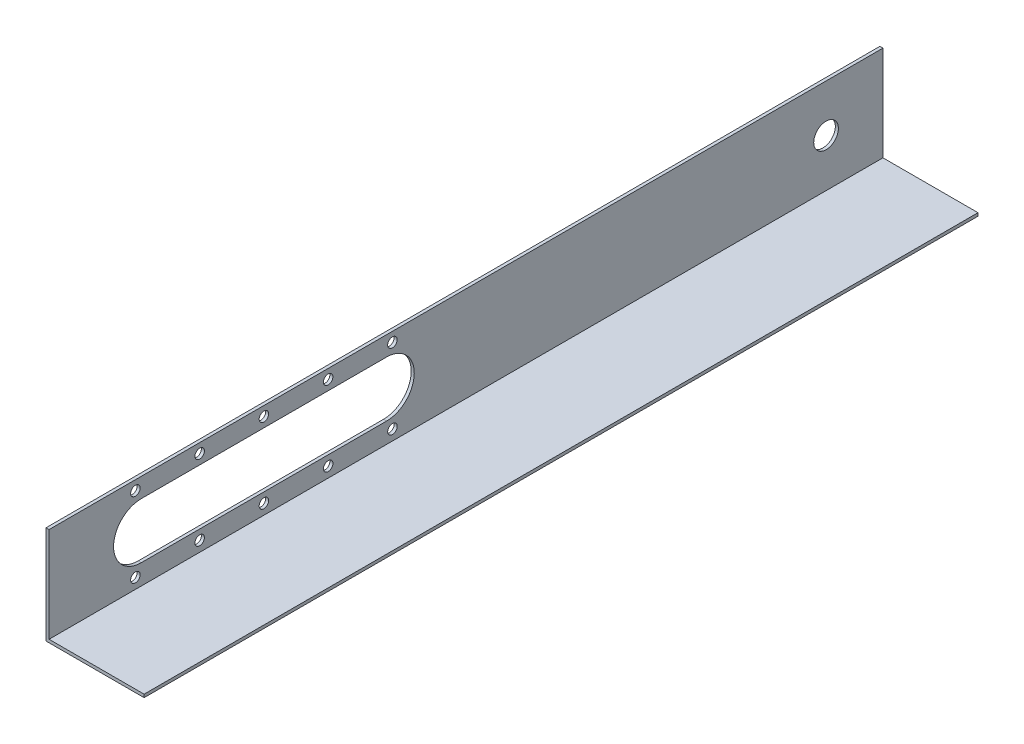
ISO-10303-21;
HEADER;
FILE_DESCRIPTION(('STEP AP214'),'2;1');
FILE_NAME('part.step','',(''),(''),'','','');
FILE_SCHEMA(('AUTOMOTIVE_DESIGN { 1 0 10303 214 1 1 1 1 }'));
ENDSEC;
DATA;
#1=APPLICATION_CONTEXT('core data for automotive mechanical design processes');
#2=APPLICATION_PROTOCOL_DEFINITION('international standard','automotive_design',2000,#1);
#3=PRODUCT_CONTEXT('',#1,'mechanical');
#4=PRODUCT('Part','Part','',(#3));
#5=PRODUCT_RELATED_PRODUCT_CATEGORY('part','',(#4));
#6=PRODUCT_DEFINITION_FORMATION('','',#4);
#7=PRODUCT_DEFINITION_CONTEXT('part definition',#1,'design');
#8=PRODUCT_DEFINITION('design','',#6,#7);
#9=PRODUCT_DEFINITION_SHAPE('','',#8);
#10=(LENGTH_UNIT() NAMED_UNIT(*) SI_UNIT(.MILLI.,.METRE.));
#11=(NAMED_UNIT(*) PLANE_ANGLE_UNIT() SI_UNIT($,.RADIAN.));
#12=(NAMED_UNIT(*) SI_UNIT($,.STERADIAN.) SOLID_ANGLE_UNIT());
#13=UNCERTAINTY_MEASURE_WITH_UNIT(LENGTH_MEASURE(1.E-05),#10,'distance_accuracy_value','');
#14=(GEOMETRIC_REPRESENTATION_CONTEXT(3) GLOBAL_UNCERTAINTY_ASSIGNED_CONTEXT((#13)) GLOBAL_UNIT_ASSIGNED_CONTEXT((#10,
#11,#12)) REPRESENTATION_CONTEXT('',''));
#15=CARTESIAN_POINT('',(0.,0.,0.));
#16=DIRECTION('',(0.,0.,1.));
#17=DIRECTION('',(1.,0.,0.));
#18=AXIS2_PLACEMENT_3D('',#15,#16,#17);
#19=CARTESIAN_POINT('',(0.,0.,431.8));
#20=DIRECTION('',(-1.,0.,0.));
#21=DIRECTION('',(0.,-1.,0.));
#22=AXIS2_PLACEMENT_3D('',#19,#20,#21);
#23=PLANE('',#22);
#24=CARTESIAN_POINT('',(0.,44.2595,320.548));
#25=DIRECTION('',(1.,0.,0.));
#26=DIRECTION('',(0.,0.,-1.));
#27=AXIS2_PLACEMENT_3D('',#24,#25,#26);
#28=CIRCLE('',#27,2.45744999999999);
#29=CARTESIAN_POINT('',(0.,44.2595,318.09055));
#30=VERTEX_POINT('',#29);
#31=EDGE_CURVE('E458',#30,#30,#28,.T.);
#32=ORIENTED_EDGE('',*,*,#31,.F.);
#33=EDGE_LOOP('',(#32));
#34=FACE_BOUND('',#33,.T.);
#35=CARTESIAN_POINT('',(0.,44.2595,287.274));
#36=DIRECTION('',(1.,0.,0.));
#37=DIRECTION('',(0.,0.,-1.));
#38=AXIS2_PLACEMENT_3D('',#35,#36,#37);
#39=CIRCLE('',#38,2.45744999999999);
#40=CARTESIAN_POINT('',(0.,44.2595,284.81655));
#41=VERTEX_POINT('',#40);
#42=EDGE_CURVE('E264',#41,#41,#39,.T.);
#43=ORIENTED_EDGE('',*,*,#42,.F.);
#44=EDGE_LOOP('',(#43));
#45=FACE_BOUND('',#44,.T.);
#46=CARTESIAN_POINT('',(0.,5.39749999999999,320.548));
#47=DIRECTION('',(1.,0.,0.));
#48=DIRECTION('',(0.,0.,-1.));
#49=AXIS2_PLACEMENT_3D('',#46,#47,#48);
#50=CIRCLE('',#49,2.45744999999999);
#51=CARTESIAN_POINT('',(0.,5.39749999999999,318.09055));
#52=VERTEX_POINT('',#51);
#53=EDGE_CURVE('E261',#52,#52,#50,.T.);
#54=ORIENTED_EDGE('',*,*,#53,.F.);
#55=EDGE_LOOP('',(#54));
#56=FACE_BOUND('',#55,.T.);
#57=CARTESIAN_POINT('',(0.,5.39749999999999,254.));
#58=DIRECTION('',(1.,0.,0.));
#59=DIRECTION('',(0.,0.,-1.));
#60=AXIS2_PLACEMENT_3D('',#57,#58,#59);
#61=CIRCLE('',#60,2.45744999999999);
#62=CARTESIAN_POINT('',(0.,5.39749999999999,251.54255));
#63=VERTEX_POINT('',#62);
#64=EDGE_CURVE('E277',#63,#63,#61,.T.);
#65=ORIENTED_EDGE('',*,*,#64,.F.);
#66=EDGE_LOOP('',(#65));
#67=FACE_BOUND('',#66,.T.);
#68=CARTESIAN_POINT('',(0.,44.2595,353.822));
#69=DIRECTION('',(1.,0.,0.));
#70=DIRECTION('',(0.,0.,-1.));
#71=AXIS2_PLACEMENT_3D('',#68,#69,#70);
#72=CIRCLE('',#71,2.45744999999999);
#73=CARTESIAN_POINT('',(0.,44.2595,351.36455));
#74=VERTEX_POINT('',#73);
#75=EDGE_CURVE('E283',#74,#74,#72,.T.);
#76=ORIENTED_EDGE('',*,*,#75,.F.);
#77=EDGE_LOOP('',(#76));
#78=FACE_BOUND('',#77,.T.);
#79=CARTESIAN_POINT('',(0.,44.2595,387.096));
#80=DIRECTION('',(1.,0.,0.));
#81=DIRECTION('',(0.,0.,-1.));
#82=AXIS2_PLACEMENT_3D('',#79,#80,#81);
#83=CIRCLE('',#82,2.45744999999999);
#84=CARTESIAN_POINT('',(0.,44.2595,384.63855));
#85=VERTEX_POINT('',#84);
#86=EDGE_CURVE('E289',#85,#85,#83,.T.);
#87=ORIENTED_EDGE('',*,*,#86,.F.);
#88=EDGE_LOOP('',(#87));
#89=FACE_BOUND('',#88,.T.);
#90=CARTESIAN_POINT('',(0.,5.39749999999999,387.096));
#91=DIRECTION('',(1.,0.,0.));
#92=DIRECTION('',(0.,0.,-1.));
#93=AXIS2_PLACEMENT_3D('',#90,#91,#92);
#94=CIRCLE('',#93,2.45744999999999);
#95=CARTESIAN_POINT('',(0.,5.39749999999999,384.63855));
#96=VERTEX_POINT('',#95);
#97=EDGE_CURVE('E295',#96,#96,#94,.T.);
#98=ORIENTED_EDGE('',*,*,#97,.F.);
#99=EDGE_LOOP('',(#98));
#100=FACE_BOUND('',#99,.T.);
#101=CARTESIAN_POINT('',(0.,5.39749999999999,353.822));
#102=DIRECTION('',(1.,0.,0.));
#103=DIRECTION('',(0.,0.,-1.));
#104=AXIS2_PLACEMENT_3D('',#101,#102,#103);
#105=CIRCLE('',#104,2.45744999999999);
#106=CARTESIAN_POINT('',(0.,5.39749999999999,351.36455));
#107=VERTEX_POINT('',#106);
#108=EDGE_CURVE('E301',#107,#107,#105,.T.);
#109=ORIENTED_EDGE('',*,*,#108,.F.);
#110=EDGE_LOOP('',(#109));
#111=FACE_BOUND('',#110,.T.);
#112=CARTESIAN_POINT('',(0.,24.7735948291677,29.464));
#113=DIRECTION('',(1.,0.,0.));
#114=DIRECTION('',(0.,1.,0.));
#115=AXIS2_PLACEMENT_3D('',#112,#113,#114);
#116=CIRCLE('',#115,6.38810000000003);
#117=CARTESIAN_POINT('',(0.,31.1616948291677,29.464));
#118=VERTEX_POINT('',#117);
#119=EDGE_CURVE('E307',#118,#118,#116,.T.);
#120=ORIENTED_EDGE('',*,*,#119,.F.);
#121=EDGE_LOOP('',(#120));
#122=FACE_BOUND('',#121,.T.);
#123=DIRECTION('',(0.,0.,-1.));
#124=VECTOR('',#123,1.);
#125=CARTESIAN_POINT('',(0.,10.4775,384.048));
#126=LINE('',#125,#124);
#127=CARTESIAN_POINT('',(0.,10.4775,384.048));
#128=VERTEX_POINT('',#127);
#129=CARTESIAN_POINT('',(0.,10.4775,257.048));
#130=VERTEX_POINT('',#129);
#131=EDGE_CURVE('E123',#128,#130,#126,.T.);
#132=ORIENTED_EDGE('',*,*,#131,.F.);
#133=CARTESIAN_POINT('',(0.,24.8285,384.048));
#134=DIRECTION('',(1.,0.,0.));
#135=DIRECTION('',(0.,1.,0.));
#136=AXIS2_PLACEMENT_3D('',#133,#134,#135);
#137=CIRCLE('',#136,14.351);
#138=CARTESIAN_POINT('',(0.,39.1795,384.048));
#139=VERTEX_POINT('',#138);
#140=EDGE_CURVE('E49',#139,#128,#137,.T.);
#141=ORIENTED_EDGE('',*,*,#140,.F.);
#142=DIRECTION('',(0.,0.,1.));
#143=VECTOR('',#142,1.);
#144=CARTESIAN_POINT('',(0.,39.1795,384.048));
#145=LINE('',#144,#143);
#146=CARTESIAN_POINT('',(0.,39.1795,257.048));
#147=VERTEX_POINT('',#146);
#148=EDGE_CURVE('E129',#147,#139,#145,.T.);
#149=ORIENTED_EDGE('',*,*,#148,.F.);
#150=CARTESIAN_POINT('',(0.,24.8285,257.048));
#151=DIRECTION('',(1.,0.,0.));
#152=DIRECTION('',(0.,1.,0.));
#153=AXIS2_PLACEMENT_3D('',#150,#151,#152);
#154=CIRCLE('',#153,14.351);
#155=EDGE_CURVE('E114',#130,#147,#154,.T.);
#156=ORIENTED_EDGE('',*,*,#155,.F.);
#157=EDGE_LOOP('',(#132,#141,#149,#156));
#158=FACE_BOUND('',#157,.T.);
#159=DIRECTION('',(0.,1.,0.));
#160=VECTOR('',#159,1.);
#161=CARTESIAN_POINT('',(0.,0.,0.));
#162=LINE('',#161,#160);
#163=CARTESIAN_POINT('',(0.,0.,0.));
#164=VERTEX_POINT('',#163);
#165=CARTESIAN_POINT('',(0.,49.2125,0.));
#166=VERTEX_POINT('',#165);
#167=EDGE_CURVE('E156',#164,#166,#162,.T.);
#168=ORIENTED_EDGE('',*,*,#167,.T.);
#169=DIRECTION('',(0.,0.,-1.));
#170=VECTOR('',#169,1.);
#171=CARTESIAN_POINT('',(0.,49.2125,431.8));
#172=LINE('',#171,#170);
#173=CARTESIAN_POINT('',(0.,49.2125,431.8));
#174=VERTEX_POINT('',#173);
#175=EDGE_CURVE('E176',#174,#166,#172,.T.);
#176=ORIENTED_EDGE('',*,*,#175,.F.);
#177=DIRECTION('',(0.,1.,0.));
#178=VECTOR('',#177,1.);
#179=CARTESIAN_POINT('',(0.,0.,431.8));
#180=LINE('',#179,#178);
#181=CARTESIAN_POINT('',(0.,0.,431.8));
#182=VERTEX_POINT('',#181);
#183=EDGE_CURVE('E142',#182,#174,#180,.T.);
#184=ORIENTED_EDGE('',*,*,#183,.F.);
#185=DIRECTION('',(0.,0.,-1.));
#186=VECTOR('',#185,1.);
#187=CARTESIAN_POINT('',(0.,0.,431.8));
#188=LINE('',#187,#186);
#189=EDGE_CURVE('E179',#182,#164,#188,.T.);
#190=ORIENTED_EDGE('',*,*,#189,.T.);
#191=EDGE_LOOP('',(#168,#176,#184,#190));
#192=FACE_BOUND('',#191,.T.);
#193=CARTESIAN_POINT('',(0.,5.39749999999999,287.274));
#194=DIRECTION('',(1.,0.,0.));
#195=DIRECTION('',(0.,0.,-1.));
#196=AXIS2_PLACEMENT_3D('',#193,#194,#195);
#197=CIRCLE('',#196,2.45744999999999);
#198=CARTESIAN_POINT('',(0.,5.39749999999999,284.81655));
#199=VERTEX_POINT('',#198);
#200=EDGE_CURVE('E252',#199,#199,#197,.T.);
#201=ORIENTED_EDGE('',*,*,#200,.F.);
#202=EDGE_LOOP('',(#201));
#203=FACE_BOUND('',#202,.T.);
#204=CARTESIAN_POINT('',(0.,44.2595,254.));
#205=DIRECTION('',(1.,0.,0.));
#206=DIRECTION('',(0.,0.,-1.));
#207=AXIS2_PLACEMENT_3D('',#204,#205,#206);
#208=CIRCLE('',#207,2.45744999999999);
#209=CARTESIAN_POINT('',(0.,44.2595,251.54255));
#210=VERTEX_POINT('',#209);
#211=EDGE_CURVE('E255',#210,#210,#208,.T.);
#212=ORIENTED_EDGE('',*,*,#211,.F.);
#213=EDGE_LOOP('',(#212));
#214=FACE_BOUND('',#213,.T.);
#215=ADVANCED_FACE('F34',(#34,#45,#56,#67,#78,#89,#100,#111,#122,#158,#192,#203,#214),#23,.F.);
#216=CARTESIAN_POINT('',(49.2125,0.,431.8));
#217=DIRECTION('',(0.,-1.,0.));
#218=DIRECTION('',(1.,0.,0.));
#219=AXIS2_PLACEMENT_3D('',#216,#217,#218);
#220=PLANE('',#219);
#221=DIRECTION('',(-1.,0.,0.));
#222=VECTOR('',#221,1.);
#223=CARTESIAN_POINT('',(49.2125,0.,0.));
#224=LINE('',#223,#222);
#225=CARTESIAN_POINT('',(49.2125,0.,0.));
#226=VERTEX_POINT('',#225);
#227=EDGE_CURVE('E136',#226,#164,#224,.T.);
#228=ORIENTED_EDGE('',*,*,#227,.T.);
#229=ORIENTED_EDGE('',*,*,#189,.F.);
#230=DIRECTION('',(-1.,0.,0.));
#231=VECTOR('',#230,1.);
#232=CARTESIAN_POINT('',(49.2125,0.,431.8));
#233=LINE('',#232,#231);
#234=CARTESIAN_POINT('',(49.2125,0.,431.8));
#235=VERTEX_POINT('',#234);
#236=EDGE_CURVE('E139',#235,#182,#233,.T.);
#237=ORIENTED_EDGE('',*,*,#236,.F.);
#238=DIRECTION('',(0.,0.,-1.));
#239=VECTOR('',#238,1.);
#240=CARTESIAN_POINT('',(49.2125,0.,431.8));
#241=LINE('',#240,#239);
#242=EDGE_CURVE('E153',#235,#226,#241,.T.);
#243=ORIENTED_EDGE('',*,*,#242,.T.);
#244=EDGE_LOOP('',(#228,#229,#237,#243));
#245=FACE_BOUND('',#244,.T.);
#246=ADVANCED_FACE('F36',(#245),#220,.F.);
#247=CARTESIAN_POINT('',(0.,49.2125,431.8));
#248=DIRECTION('',(0.,-1.,0.));
#249=DIRECTION('',(1.,0.,0.));
#250=AXIS2_PLACEMENT_3D('',#247,#248,#249);
#251=PLANE('',#250);
#252=DIRECTION('',(-1.,0.,0.));
#253=VECTOR('',#252,1.);
#254=CARTESIAN_POINT('',(0.,49.2125,0.));
#255=LINE('',#254,#253);
#256=CARTESIAN_POINT('',(-1.5875,49.2125,0.));
#257=VERTEX_POINT('',#256);
#258=EDGE_CURVE('E158',#166,#257,#255,.T.);
#259=ORIENTED_EDGE('',*,*,#258,.T.);
#260=DIRECTION('',(0.,0.,-1.));
#261=VECTOR('',#260,1.);
#262=CARTESIAN_POINT('',(-1.5875,49.2125,431.8));
#263=LINE('',#262,#261);
#264=CARTESIAN_POINT('',(-1.5875,49.2125,431.8));
#265=VERTEX_POINT('',#264);
#266=EDGE_CURVE('E173',#265,#257,#263,.T.);
#267=ORIENTED_EDGE('',*,*,#266,.F.);
#268=DIRECTION('',(-1.,0.,0.));
#269=VECTOR('',#268,1.);
#270=CARTESIAN_POINT('',(0.,49.2125,431.8));
#271=LINE('',#270,#269);
#272=EDGE_CURVE('E145',#174,#265,#271,.T.);
#273=ORIENTED_EDGE('',*,*,#272,.F.);
#274=ORIENTED_EDGE('',*,*,#175,.T.);
#275=EDGE_LOOP('',(#259,#267,#273,#274));
#276=FACE_BOUND('',#275,.T.);
#277=ADVANCED_FACE('F210',(#276),#251,.F.);
#278=CARTESIAN_POINT('',(-1.5875,49.2125,431.8));
#279=DIRECTION('',(1.,0.,0.));
#280=DIRECTION('',(0.,1.,0.));
#281=AXIS2_PLACEMENT_3D('',#278,#279,#280);
#282=PLANE('',#281);
#283=CARTESIAN_POINT('',(-1.58750000000001,44.2595,320.548));
#284=DIRECTION('',(1.,0.,0.));
#285=DIRECTION('',(0.,0.,-1.));
#286=AXIS2_PLACEMENT_3D('',#283,#284,#285);
#287=CIRCLE('',#286,2.45745);
#288=CARTESIAN_POINT('',(-1.58750000000001,44.2595,318.09055));
#289=VERTEX_POINT('',#288);
#290=EDGE_CURVE('E456',#289,#289,#287,.T.);
#291=ORIENTED_EDGE('',*,*,#290,.T.);
#292=EDGE_LOOP('',(#291));
#293=FACE_BOUND('',#292,.T.);
#294=CARTESIAN_POINT('',(-1.58750000000001,44.2595,287.274));
#295=DIRECTION('',(1.,0.,0.));
#296=DIRECTION('',(0.,0.,-1.));
#297=AXIS2_PLACEMENT_3D('',#294,#295,#296);
#298=CIRCLE('',#297,2.45745);
#299=CARTESIAN_POINT('',(-1.58750000000001,44.2595,284.81655));
#300=VERTEX_POINT('',#299);
#301=EDGE_CURVE('E258',#300,#300,#298,.T.);
#302=ORIENTED_EDGE('',*,*,#301,.T.);
#303=EDGE_LOOP('',(#302));
#304=FACE_BOUND('',#303,.T.);
#305=CARTESIAN_POINT('',(-1.58750000000001,44.2595,254.));
#306=DIRECTION('',(1.,0.,0.));
#307=DIRECTION('',(0.,0.,-1.));
#308=AXIS2_PLACEMENT_3D('',#305,#306,#307);
#309=CIRCLE('',#308,2.45745);
#310=CARTESIAN_POINT('',(-1.58750000000001,44.2595,251.54255));
#311=VERTEX_POINT('',#310);
#312=EDGE_CURVE('E257',#311,#311,#309,.T.);
#313=ORIENTED_EDGE('',*,*,#312,.T.);
#314=EDGE_LOOP('',(#313));
#315=FACE_BOUND('',#314,.T.);
#316=CARTESIAN_POINT('',(-1.58750000000001,5.39749999999999,320.548));
#317=DIRECTION('',(1.,0.,0.));
#318=DIRECTION('',(0.,0.,-1.));
#319=AXIS2_PLACEMENT_3D('',#316,#317,#318);
#320=CIRCLE('',#319,2.45745);
#321=CARTESIAN_POINT('',(-1.58750000000001,5.39749999999999,318.09055));
#322=VERTEX_POINT('',#321);
#323=EDGE_CURVE('E270',#322,#322,#320,.T.);
#324=ORIENTED_EDGE('',*,*,#323,.T.);
#325=EDGE_LOOP('',(#324));
#326=FACE_BOUND('',#325,.T.);
#327=CARTESIAN_POINT('',(-1.58750000000001,5.39749999999999,287.274));
#328=DIRECTION('',(1.,0.,0.));
#329=DIRECTION('',(0.,0.,-1.));
#330=AXIS2_PLACEMENT_3D('',#327,#328,#329);
#331=CIRCLE('',#330,2.45745);
#332=CARTESIAN_POINT('',(-1.58750000000001,5.39749999999999,284.81655));
#333=VERTEX_POINT('',#332);
#334=EDGE_CURVE('E274',#333,#333,#331,.T.);
#335=ORIENTED_EDGE('',*,*,#334,.T.);
#336=EDGE_LOOP('',(#335));
#337=FACE_BOUND('',#336,.T.);
#338=CARTESIAN_POINT('',(-1.58750000000001,5.39749999999999,254.));
#339=DIRECTION('',(1.,0.,0.));
#340=DIRECTION('',(0.,0.,-1.));
#341=AXIS2_PLACEMENT_3D('',#338,#339,#340);
#342=CIRCLE('',#341,2.45745);
#343=CARTESIAN_POINT('',(-1.58750000000001,5.39749999999999,251.54255));
#344=VERTEX_POINT('',#343);
#345=EDGE_CURVE('E280',#344,#344,#342,.T.);
#346=ORIENTED_EDGE('',*,*,#345,.T.);
#347=EDGE_LOOP('',(#346));
#348=FACE_BOUND('',#347,.T.);
#349=CARTESIAN_POINT('',(-1.58750000000001,44.2595,353.822));
#350=DIRECTION('',(1.,0.,0.));
#351=DIRECTION('',(0.,0.,-1.));
#352=AXIS2_PLACEMENT_3D('',#349,#350,#351);
#353=CIRCLE('',#352,2.45745);
#354=CARTESIAN_POINT('',(-1.58750000000001,44.2595,351.36455));
#355=VERTEX_POINT('',#354);
#356=EDGE_CURVE('E286',#355,#355,#353,.T.);
#357=ORIENTED_EDGE('',*,*,#356,.T.);
#358=EDGE_LOOP('',(#357));
#359=FACE_BOUND('',#358,.T.);
#360=CARTESIAN_POINT('',(-1.58750000000001,44.2595,387.096));
#361=DIRECTION('',(1.,0.,0.));
#362=DIRECTION('',(0.,0.,-1.));
#363=AXIS2_PLACEMENT_3D('',#360,#361,#362);
#364=CIRCLE('',#363,2.45745);
#365=CARTESIAN_POINT('',(-1.58750000000001,44.2595,384.63855));
#366=VERTEX_POINT('',#365);
#367=EDGE_CURVE('E292',#366,#366,#364,.T.);
#368=ORIENTED_EDGE('',*,*,#367,.T.);
#369=EDGE_LOOP('',(#368));
#370=FACE_BOUND('',#369,.T.);
#371=CARTESIAN_POINT('',(-1.58750000000001,5.39749999999999,387.096));
#372=DIRECTION('',(1.,0.,0.));
#373=DIRECTION('',(0.,0.,-1.));
#374=AXIS2_PLACEMENT_3D('',#371,#372,#373);
#375=CIRCLE('',#374,2.45745);
#376=CARTESIAN_POINT('',(-1.58750000000001,5.39749999999999,384.63855));
#377=VERTEX_POINT('',#376);
#378=EDGE_CURVE('E298',#377,#377,#375,.T.);
#379=ORIENTED_EDGE('',*,*,#378,.T.);
#380=EDGE_LOOP('',(#379));
#381=FACE_BOUND('',#380,.T.);
#382=CARTESIAN_POINT('',(-1.58750000000001,5.39749999999999,353.822));
#383=DIRECTION('',(1.,0.,0.));
#384=DIRECTION('',(0.,0.,-1.));
#385=AXIS2_PLACEMENT_3D('',#382,#383,#384);
#386=CIRCLE('',#385,2.45745);
#387=CARTESIAN_POINT('',(-1.58750000000001,5.39749999999999,351.36455));
#388=VERTEX_POINT('',#387);
#389=EDGE_CURVE('E304',#388,#388,#386,.T.);
#390=ORIENTED_EDGE('',*,*,#389,.T.);
#391=EDGE_LOOP('',(#390));
#392=FACE_BOUND('',#391,.T.);
#393=CARTESIAN_POINT('',(-1.58750000000001,24.7735948291677,29.464));
#394=DIRECTION('',(1.,0.,0.));
#395=DIRECTION('',(0.,1.,0.));
#396=AXIS2_PLACEMENT_3D('',#393,#394,#395);
#397=CIRCLE('',#396,6.38810000000003);
#398=CARTESIAN_POINT('',(-1.58750000000001,31.1616948291677,29.464));
#399=VERTEX_POINT('',#398);
#400=EDGE_CURVE('E308',#399,#399,#397,.T.);
#401=ORIENTED_EDGE('',*,*,#400,.T.);
#402=EDGE_LOOP('',(#401));
#403=FACE_BOUND('',#402,.T.);
#404=DIRECTION('',(0.,0.,1.));
#405=VECTOR('',#404,1.);
#406=CARTESIAN_POINT('',(-1.5875,39.1795,431.8));
#407=LINE('',#406,#405);
#408=CARTESIAN_POINT('',(-1.58749999999999,39.1795,257.048));
#409=VERTEX_POINT('',#408);
#410=CARTESIAN_POINT('',(-1.58749999999999,39.1795,384.048));
#411=VERTEX_POINT('',#410);
#412=EDGE_CURVE('E42',#409,#411,#407,.T.);
#413=ORIENTED_EDGE('',*,*,#412,.T.);
#414=CARTESIAN_POINT('',(-1.58749999999999,24.8285,384.048));
#415=DIRECTION('',(1.,0.,0.));
#416=DIRECTION('',(0.,1.,0.));
#417=AXIS2_PLACEMENT_3D('',#414,#415,#416);
#418=CIRCLE('',#417,14.351);
#419=CARTESIAN_POINT('',(-1.58749999999999,10.4775,384.048));
#420=VERTEX_POINT('',#419);
#421=EDGE_CURVE('E11',#411,#420,#418,.T.);
#422=ORIENTED_EDGE('',*,*,#421,.T.);
#423=DIRECTION('',(0.,0.,-1.));
#424=VECTOR('',#423,1.);
#425=CARTESIAN_POINT('',(-1.5875,10.4775,431.8));
#426=LINE('',#425,#424);
#427=CARTESIAN_POINT('',(-1.5875,10.4775,257.048));
#428=VERTEX_POINT('',#427);
#429=EDGE_CURVE('E182',#420,#428,#426,.T.);
#430=ORIENTED_EDGE('',*,*,#429,.T.);
#431=CARTESIAN_POINT('',(-1.58749999999999,24.8285,257.048));
#432=DIRECTION('',(1.,0.,0.));
#433=DIRECTION('',(0.,1.,0.));
#434=AXIS2_PLACEMENT_3D('',#431,#432,#433);
#435=CIRCLE('',#434,14.351);
#436=EDGE_CURVE('E117',#428,#409,#435,.T.);
#437=ORIENTED_EDGE('',*,*,#436,.T.);
#438=EDGE_LOOP('',(#413,#422,#430,#437));
#439=FACE_BOUND('',#438,.T.);
#440=DIRECTION('',(0.,-1.,0.));
#441=VECTOR('',#440,1.);
#442=CARTESIAN_POINT('',(-1.5875,49.2125,0.));
#443=LINE('',#442,#441);
#444=CARTESIAN_POINT('',(-1.58750000000001,-1.5875,0.));
#445=VERTEX_POINT('',#444);
#446=EDGE_CURVE('E160',#257,#445,#443,.T.);
#447=ORIENTED_EDGE('',*,*,#446,.T.);
#448=DIRECTION('',(0.,0.,-1.));
#449=VECTOR('',#448,1.);
#450=CARTESIAN_POINT('',(-1.58750000000001,-1.5875,431.8));
#451=LINE('',#450,#449);
#452=CARTESIAN_POINT('',(-1.58750000000001,-1.5875,431.8));
#453=VERTEX_POINT('',#452);
#454=EDGE_CURVE('E170',#453,#445,#451,.T.);
#455=ORIENTED_EDGE('',*,*,#454,.F.);
#456=DIRECTION('',(0.,-1.,0.));
#457=VECTOR('',#456,1.);
#458=CARTESIAN_POINT('',(-1.5875,49.2125,431.8));
#459=LINE('',#458,#457);
#460=EDGE_CURVE('E147',#265,#453,#459,.T.);
#461=ORIENTED_EDGE('',*,*,#460,.F.);
#462=ORIENTED_EDGE('',*,*,#266,.T.);
#463=EDGE_LOOP('',(#447,#455,#461,#462));
#464=FACE_BOUND('',#463,.T.);
#465=ADVANCED_FACE('F186',(#293,#304,#315,#326,#337,#348,#359,#370,#381,#392,#403,#439,#464),
#282,.F.);
#466=CARTESIAN_POINT('',(-1.58750000000001,-1.5875,431.8));
#467=DIRECTION('',(0.,1.,0.));
#468=DIRECTION('',(-1.,0.,0.));
#469=AXIS2_PLACEMENT_3D('',#466,#467,#468);
#470=PLANE('',#469);
#471=DIRECTION('',(1.,0.,0.));
#472=VECTOR('',#471,1.);
#473=CARTESIAN_POINT('',(-1.58750000000001,-1.5875,0.));
#474=LINE('',#473,#472);
#475=CARTESIAN_POINT('',(49.2125,-1.58749999999999,0.));
#476=VERTEX_POINT('',#475);
#477=EDGE_CURVE('E162',#445,#476,#474,.T.);
#478=ORIENTED_EDGE('',*,*,#477,.T.);
#479=DIRECTION('',(0.,0.,-1.));
#480=VECTOR('',#479,1.);
#481=CARTESIAN_POINT('',(49.2125,-1.58749999999999,431.8));
#482=LINE('',#481,#480);
#483=CARTESIAN_POINT('',(49.2125,-1.58749999999999,431.8));
#484=VERTEX_POINT('',#483);
#485=EDGE_CURVE('E167',#484,#476,#482,.T.);
#486=ORIENTED_EDGE('',*,*,#485,.F.);
#487=DIRECTION('',(1.,0.,0.));
#488=VECTOR('',#487,1.);
#489=CARTESIAN_POINT('',(-1.58750000000001,-1.5875,431.8));
#490=LINE('',#489,#488);
#491=EDGE_CURVE('E149',#453,#484,#490,.T.);
#492=ORIENTED_EDGE('',*,*,#491,.F.);
#493=ORIENTED_EDGE('',*,*,#454,.T.);
#494=EDGE_LOOP('',(#478,#486,#492,#493));
#495=FACE_BOUND('',#494,.T.);
#496=ADVANCED_FACE('F220',(#495),#470,.F.);
#497=CARTESIAN_POINT('',(49.2125,-1.58749999999999,431.8));
#498=DIRECTION('',(-1.,0.,0.));
#499=DIRECTION('',(0.,-1.,0.));
#500=AXIS2_PLACEMENT_3D('',#497,#498,#499);
#501=PLANE('',#500);
#502=DIRECTION('',(0.,1.,0.));
#503=VECTOR('',#502,1.);
#504=CARTESIAN_POINT('',(49.2125,-1.58749999999999,0.));
#505=LINE('',#504,#503);
#506=EDGE_CURVE('E143',#476,#226,#505,.T.);
#507=ORIENTED_EDGE('',*,*,#506,.T.);
#508=ORIENTED_EDGE('',*,*,#242,.F.);
#509=DIRECTION('',(0.,1.,0.));
#510=VECTOR('',#509,1.);
#511=CARTESIAN_POINT('',(49.2125,-1.58749999999999,431.8));
#512=LINE('',#511,#510);
#513=EDGE_CURVE('E151',#484,#235,#512,.T.);
#514=ORIENTED_EDGE('',*,*,#513,.F.);
#515=ORIENTED_EDGE('',*,*,#485,.T.);
#516=EDGE_LOOP('',(#507,#508,#514,#515));
#517=FACE_BOUND('',#516,.T.);
#518=ADVANCED_FACE('F224',(#517),#501,.F.);
#519=CARTESIAN_POINT('',(0.,0.,431.8));
#520=DIRECTION('',(0.,0.,-1.));
#521=DIRECTION('',(-1.,0.,0.));
#522=AXIS2_PLACEMENT_3D('',#519,#520,#521);
#523=PLANE('',#522);
#524=ORIENTED_EDGE('',*,*,#236,.T.);
#525=ORIENTED_EDGE('',*,*,#183,.T.);
#526=ORIENTED_EDGE('',*,*,#272,.T.);
#527=ORIENTED_EDGE('',*,*,#460,.T.);
#528=ORIENTED_EDGE('',*,*,#491,.T.);
#529=ORIENTED_EDGE('',*,*,#513,.T.);
#530=EDGE_LOOP('',(#524,#525,#526,#527,#528,#529));
#531=FACE_BOUND('',#530,.T.);
#532=ADVANCED_FACE('F200',(#531),#523,.F.);
#533=CARTESIAN_POINT('',(0.,0.,0.));
#534=DIRECTION('',(0.,0.,-1.));
#535=DIRECTION('',(-1.,0.,0.));
#536=AXIS2_PLACEMENT_3D('',#533,#534,#535);
#537=PLANE('',#536);
#538=ORIENTED_EDGE('',*,*,#227,.F.);
#539=ORIENTED_EDGE('',*,*,#506,.F.);
#540=ORIENTED_EDGE('',*,*,#477,.F.);
#541=ORIENTED_EDGE('',*,*,#446,.F.);
#542=ORIENTED_EDGE('',*,*,#258,.F.);
#543=ORIENTED_EDGE('',*,*,#167,.F.);
#544=EDGE_LOOP('',(#538,#539,#540,#541,#542,#543));
#545=FACE_BOUND('',#544,.T.);
#546=ADVANCED_FACE('F193',(#545),#537,.T.);
#547=CARTESIAN_POINT('',(-127.,24.8285,384.048));
#548=DIRECTION('',(1.,0.,0.));
#549=DIRECTION('',(0.,1.,0.));
#550=AXIS2_PLACEMENT_3D('',#547,#548,#549);
#551=CYLINDRICAL_SURFACE('',#550,14.351);
#552=DIRECTION('',(1.,0.,0.));
#553=VECTOR('',#552,1.);
#554=CARTESIAN_POINT('',(-127.,39.1795,384.048));
#555=LINE('',#554,#553);
#556=EDGE_CURVE('E134',#411,#139,#555,.T.);
#557=ORIENTED_EDGE('',*,*,#556,.T.);
#558=ORIENTED_EDGE('',*,*,#140,.T.);
#559=DIRECTION('',(1.,0.,0.));
#560=VECTOR('',#559,1.);
#561=CARTESIAN_POINT('',(-127.,10.4775,384.048));
#562=LINE('',#561,#560);
#563=EDGE_CURVE('E120',#420,#128,#562,.T.);
#564=ORIENTED_EDGE('',*,*,#563,.F.);
#565=ORIENTED_EDGE('',*,*,#421,.F.);
#566=EDGE_LOOP('',(#557,#558,#564,#565));
#567=FACE_BOUND('',#566,.T.);
#568=ADVANCED_FACE('F191',(#567),#551,.F.);
#569=CARTESIAN_POINT('',(-127.,39.1795,384.048));
#570=DIRECTION('',(0.,1.,0.));
#571=DIRECTION('',(-1.,0.,0.));
#572=AXIS2_PLACEMENT_3D('',#569,#570,#571);
#573=PLANE('',#572);
#574=DIRECTION('',(1.,0.,0.));
#575=VECTOR('',#574,1.);
#576=CARTESIAN_POINT('',(-127.,39.1795,257.048));
#577=LINE('',#576,#575);
#578=EDGE_CURVE('E119',#409,#147,#577,.T.);
#579=ORIENTED_EDGE('',*,*,#578,.T.);
#580=ORIENTED_EDGE('',*,*,#148,.T.);
#581=ORIENTED_EDGE('',*,*,#556,.F.);
#582=ORIENTED_EDGE('',*,*,#412,.F.);
#583=EDGE_LOOP('',(#579,#580,#581,#582));
#584=FACE_BOUND('',#583,.T.);
#585=ADVANCED_FACE('F190',(#584),#573,.F.);
#586=CARTESIAN_POINT('',(-127.,24.8285,257.048));
#587=DIRECTION('',(1.,0.,0.));
#588=DIRECTION('',(0.,1.,0.));
#589=AXIS2_PLACEMENT_3D('',#586,#587,#588);
#590=CYLINDRICAL_SURFACE('',#589,14.351);
#591=DIRECTION('',(1.,0.,0.));
#592=VECTOR('',#591,1.);
#593=CARTESIAN_POINT('',(-127.,10.4775,257.048));
#594=LINE('',#593,#592);
#595=EDGE_CURVE('E57',#428,#130,#594,.T.);
#596=ORIENTED_EDGE('',*,*,#595,.T.);
#597=ORIENTED_EDGE('',*,*,#155,.T.);
#598=ORIENTED_EDGE('',*,*,#578,.F.);
#599=ORIENTED_EDGE('',*,*,#436,.F.);
#600=EDGE_LOOP('',(#596,#597,#598,#599));
#601=FACE_BOUND('',#600,.T.);
#602=ADVANCED_FACE('F111',(#601),#590,.F.);
#603=CARTESIAN_POINT('',(-127.,10.4775,384.048));
#604=DIRECTION('',(0.,-1.,0.));
#605=DIRECTION('',(1.,0.,0.));
#606=AXIS2_PLACEMENT_3D('',#603,#604,#605);
#607=PLANE('',#606);
#608=ORIENTED_EDGE('',*,*,#563,.T.);
#609=ORIENTED_EDGE('',*,*,#131,.T.);
#610=ORIENTED_EDGE('',*,*,#595,.F.);
#611=ORIENTED_EDGE('',*,*,#429,.F.);
#612=EDGE_LOOP('',(#608,#609,#610,#611));
#613=FACE_BOUND('',#612,.T.);
#614=ADVANCED_FACE('F124',(#613),#607,.F.);
#615=CARTESIAN_POINT('',(-1.58750000000001,24.7735948291677,29.464));
#616=DIRECTION('',(1.,0.,0.));
#617=DIRECTION('',(0.,1.,0.));
#618=AXIS2_PLACEMENT_3D('',#615,#616,#617);
#619=CYLINDRICAL_SURFACE('',#618,6.38810000000003);
#620=ORIENTED_EDGE('',*,*,#400,.F.);
#621=EDGE_LOOP('',(#620));
#622=FACE_BOUND('',#621,.T.);
#623=ORIENTED_EDGE('',*,*,#119,.T.);
#624=EDGE_LOOP('',(#623));
#625=FACE_BOUND('',#624,.T.);
#626=ADVANCED_FACE('F314',(#622,#625),#619,.F.);
#627=CARTESIAN_POINT('',(0.,5.39749999999999,353.822));
#628=DIRECTION('',(1.,0.,0.));
#629=DIRECTION('',(0.,0.,-1.));
#630=AXIS2_PLACEMENT_3D('',#627,#628,#629);
#631=CYLINDRICAL_SURFACE('',#630,2.45744999999999);
#632=ORIENTED_EDGE('',*,*,#389,.F.);
#633=EDGE_LOOP('',(#632));
#634=FACE_BOUND('',#633,.T.);
#635=ORIENTED_EDGE('',*,*,#108,.T.);
#636=EDGE_LOOP('',(#635));
#637=FACE_BOUND('',#636,.T.);
#638=ADVANCED_FACE('F317',(#634,#637),#631,.F.);
#639=CARTESIAN_POINT('',(0.,5.39749999999999,387.096));
#640=DIRECTION('',(1.,0.,0.));
#641=DIRECTION('',(0.,0.,-1.));
#642=AXIS2_PLACEMENT_3D('',#639,#640,#641);
#643=CYLINDRICAL_SURFACE('',#642,2.45744999999999);
#644=ORIENTED_EDGE('',*,*,#378,.F.);
#645=EDGE_LOOP('',(#644));
#646=FACE_BOUND('',#645,.T.);
#647=ORIENTED_EDGE('',*,*,#97,.T.);
#648=EDGE_LOOP('',(#647));
#649=FACE_BOUND('',#648,.T.);
#650=ADVANCED_FACE('F324',(#646,#649),#643,.F.);
#651=CARTESIAN_POINT('',(0.,44.2595,387.096));
#652=DIRECTION('',(1.,0.,0.));
#653=DIRECTION('',(0.,0.,-1.));
#654=AXIS2_PLACEMENT_3D('',#651,#652,#653);
#655=CYLINDRICAL_SURFACE('',#654,2.45744999999999);
#656=ORIENTED_EDGE('',*,*,#367,.F.);
#657=EDGE_LOOP('',(#656));
#658=FACE_BOUND('',#657,.T.);
#659=ORIENTED_EDGE('',*,*,#86,.T.);
#660=EDGE_LOOP('',(#659));
#661=FACE_BOUND('',#660,.T.);
#662=ADVANCED_FACE('F370',(#658,#661),#655,.F.);
#663=CARTESIAN_POINT('',(0.,44.2595,353.822));
#664=DIRECTION('',(1.,0.,0.));
#665=DIRECTION('',(0.,0.,-1.));
#666=AXIS2_PLACEMENT_3D('',#663,#664,#665);
#667=CYLINDRICAL_SURFACE('',#666,2.45744999999999);
#668=ORIENTED_EDGE('',*,*,#356,.F.);
#669=EDGE_LOOP('',(#668));
#670=FACE_BOUND('',#669,.T.);
#671=ORIENTED_EDGE('',*,*,#75,.T.);
#672=EDGE_LOOP('',(#671));
#673=FACE_BOUND('',#672,.T.);
#674=ADVANCED_FACE('F379',(#670,#673),#667,.F.);
#675=CARTESIAN_POINT('',(0.,5.39749999999999,254.));
#676=DIRECTION('',(1.,0.,0.));
#677=DIRECTION('',(0.,0.,-1.));
#678=AXIS2_PLACEMENT_3D('',#675,#676,#677);
#679=CYLINDRICAL_SURFACE('',#678,2.45744999999999);
#680=ORIENTED_EDGE('',*,*,#345,.F.);
#681=EDGE_LOOP('',(#680));
#682=FACE_BOUND('',#681,.T.);
#683=ORIENTED_EDGE('',*,*,#64,.T.);
#684=EDGE_LOOP('',(#683));
#685=FACE_BOUND('',#684,.T.);
#686=ADVANCED_FACE('F389',(#682,#685),#679,.F.);
#687=CARTESIAN_POINT('',(0.,5.39749999999999,287.274));
#688=DIRECTION('',(1.,0.,0.));
#689=DIRECTION('',(0.,0.,-1.));
#690=AXIS2_PLACEMENT_3D('',#687,#688,#689);
#691=CYLINDRICAL_SURFACE('',#690,2.45744999999999);
#692=ORIENTED_EDGE('',*,*,#334,.F.);
#693=EDGE_LOOP('',(#692));
#694=FACE_BOUND('',#693,.T.);
#695=ORIENTED_EDGE('',*,*,#200,.T.);
#696=EDGE_LOOP('',(#695));
#697=FACE_BOUND('',#696,.T.);
#698=ADVANCED_FACE('F399',(#694,#697),#691,.F.);
#699=CARTESIAN_POINT('',(0.,5.39749999999999,320.548));
#700=DIRECTION('',(1.,0.,0.));
#701=DIRECTION('',(0.,0.,-1.));
#702=AXIS2_PLACEMENT_3D('',#699,#700,#701);
#703=CYLINDRICAL_SURFACE('',#702,2.45744999999999);
#704=ORIENTED_EDGE('',*,*,#323,.F.);
#705=EDGE_LOOP('',(#704));
#706=FACE_BOUND('',#705,.T.);
#707=ORIENTED_EDGE('',*,*,#53,.T.);
#708=EDGE_LOOP('',(#707));
#709=FACE_BOUND('',#708,.T.);
#710=ADVANCED_FACE('F409',(#706,#709),#703,.F.);
#711=CARTESIAN_POINT('',(0.,44.2595,254.));
#712=DIRECTION('',(1.,0.,0.));
#713=DIRECTION('',(0.,0.,-1.));
#714=AXIS2_PLACEMENT_3D('',#711,#712,#713);
#715=CYLINDRICAL_SURFACE('',#714,2.45744999999999);
#716=ORIENTED_EDGE('',*,*,#312,.F.);
#717=EDGE_LOOP('',(#716));
#718=FACE_BOUND('',#717,.T.);
#719=ORIENTED_EDGE('',*,*,#211,.T.);
#720=EDGE_LOOP('',(#719));
#721=FACE_BOUND('',#720,.T.);
#722=ADVANCED_FACE('F419',(#718,#721),#715,.F.);
#723=CARTESIAN_POINT('',(0.,44.2595,287.274));
#724=DIRECTION('',(1.,0.,0.));
#725=DIRECTION('',(0.,0.,-1.));
#726=AXIS2_PLACEMENT_3D('',#723,#724,#725);
#727=CYLINDRICAL_SURFACE('',#726,2.45744999999999);
#728=ORIENTED_EDGE('',*,*,#301,.F.);
#729=EDGE_LOOP('',(#728));
#730=FACE_BOUND('',#729,.T.);
#731=ORIENTED_EDGE('',*,*,#42,.T.);
#732=EDGE_LOOP('',(#731));
#733=FACE_BOUND('',#732,.T.);
#734=ADVANCED_FACE('F429',(#730,#733),#727,.F.);
#735=CARTESIAN_POINT('',(0.,44.2595,320.548));
#736=DIRECTION('',(1.,0.,0.));
#737=DIRECTION('',(0.,0.,-1.));
#738=AXIS2_PLACEMENT_3D('',#735,#736,#737);
#739=CYLINDRICAL_SURFACE('',#738,2.45744999999999);
#740=ORIENTED_EDGE('',*,*,#290,.F.);
#741=EDGE_LOOP('',(#740));
#742=FACE_BOUND('',#741,.T.);
#743=ORIENTED_EDGE('',*,*,#31,.T.);
#744=EDGE_LOOP('',(#743));
#745=FACE_BOUND('',#744,.T.);
#746=ADVANCED_FACE('F439',(#742,#745),#739,.F.);
#747=CLOSED_SHELL('',(#215,#246,#277,#465,#496,#518,#532,#546,#568,#585,#602,#614,#626,#638,
#650,#662,#674,#686,#698,#710,#722,#734,#746));
#748=MANIFOLD_SOLID_BREP('B2',#747);
#749=ADVANCED_BREP_SHAPE_REPRESENTATION('',(#18,#748),#14);
#750=SHAPE_DEFINITION_REPRESENTATION(#9,#749);
ENDSEC;
END-ISO-10303-21;
